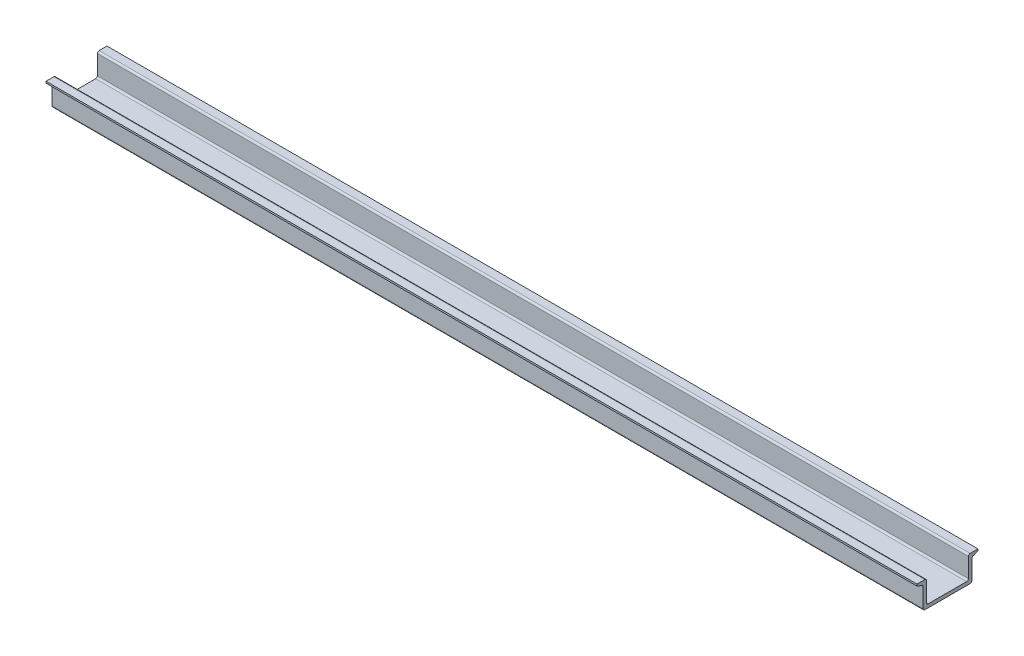
ISO-10303-21;
HEADER;
FILE_DESCRIPTION(('STEP AP214'),'2;1');
FILE_NAME('part.step','',(''),(''),'','','');
FILE_SCHEMA(('AUTOMOTIVE_DESIGN { 1 0 10303 214 1 1 1 1 }'));
ENDSEC;
DATA;
#1=APPLICATION_CONTEXT('core data for automotive mechanical design processes');
#2=APPLICATION_PROTOCOL_DEFINITION('international standard','automotive_design',2000,#1);
#3=PRODUCT_CONTEXT('',#1,'mechanical');
#4=PRODUCT('Part','Part','',(#3));
#5=PRODUCT_RELATED_PRODUCT_CATEGORY('part','',(#4));
#6=PRODUCT_DEFINITION_FORMATION('','',#4);
#7=PRODUCT_DEFINITION_CONTEXT('part definition',#1,'design');
#8=PRODUCT_DEFINITION('design','',#6,#7);
#9=PRODUCT_DEFINITION_SHAPE('','',#8);
#10=(LENGTH_UNIT() NAMED_UNIT(*) SI_UNIT(.MILLI.,.METRE.));
#11=(NAMED_UNIT(*) PLANE_ANGLE_UNIT() SI_UNIT($,.RADIAN.));
#12=(NAMED_UNIT(*) SI_UNIT($,.STERADIAN.) SOLID_ANGLE_UNIT());
#13=UNCERTAINTY_MEASURE_WITH_UNIT(LENGTH_MEASURE(1.E-05),#10,'distance_accuracy_value','');
#14=(GEOMETRIC_REPRESENTATION_CONTEXT(3) GLOBAL_UNCERTAINTY_ASSIGNED_CONTEXT((#13)) GLOBAL_UNIT_ASSIGNED_CONTEXT((#10,
#11,#12)) REPRESENTATION_CONTEXT('',''));
#15=CARTESIAN_POINT('',(0.,0.,0.));
#16=DIRECTION('',(0.,0.,1.));
#17=DIRECTION('',(1.,0.,0.));
#18=AXIS2_PLACEMENT_3D('',#15,#16,#17);
#19=CARTESIAN_POINT('',(500.,-2.,0.));
#20=DIRECTION('',(0.,0.,-1.));
#21=DIRECTION('',(-1.,0.,0.));
#22=AXIS2_PLACEMENT_3D('',#19,#20,#21);
#23=PLANE('',#22);
#24=DIRECTION('',(0.,-1.,0.));
#25=VECTOR('',#24,1.);
#26=CARTESIAN_POINT('',(0.,-2.,0.));
#27=LINE('',#26,#25);
#28=CARTESIAN_POINT('',(0.,0.,0.));
#29=VERTEX_POINT('',#28);
#30=CARTESIAN_POINT('',(0.,-1.0027628361955,0.));
#31=VERTEX_POINT('',#30);
#32=EDGE_CURVE('E208',#29,#31,#27,.T.);
#33=ORIENTED_EDGE('',*,*,#32,.T.);
#34=DIRECTION('',(1.,0.,0.));
#35=VECTOR('',#34,1.);
#36=CARTESIAN_POINT('',(500.,-1.0027628361955,0.));
#37=LINE('',#36,#35);
#38=CARTESIAN_POINT('',(500.,-1.0027628361955,0.));
#39=VERTEX_POINT('',#38);
#40=EDGE_CURVE('E310',#31,#39,#37,.T.);
#41=ORIENTED_EDGE('',*,*,#40,.T.);
#42=DIRECTION('',(0.,-1.,0.));
#43=VECTOR('',#42,1.);
#44=CARTESIAN_POINT('',(500.,-2.,0.));
#45=LINE('',#44,#43);
#46=CARTESIAN_POINT('',(500.,0.,0.));
#47=VERTEX_POINT('',#46);
#48=EDGE_CURVE('E234',#47,#39,#45,.T.);
#49=ORIENTED_EDGE('',*,*,#48,.F.);
#50=DIRECTION('',(-1.,0.,0.));
#51=VECTOR('',#50,1.);
#52=CARTESIAN_POINT('',(500.,0.,0.));
#53=LINE('',#52,#51);
#54=EDGE_CURVE('E189',#47,#29,#53,.T.);
#55=ORIENTED_EDGE('',*,*,#54,.T.);
#56=EDGE_LOOP('',(#33,#41,#49,#55));
#57=FACE_BOUND('',#56,.T.);
#58=ADVANCED_FACE('F33',(#57),#23,.F.);
#59=CARTESIAN_POINT('',(500.,-15.,-3.5));
#60=DIRECTION('',(0.,0.,-1.));
#61=DIRECTION('',(-1.,0.,0.));
#62=AXIS2_PLACEMENT_3D('',#59,#60,#61);
#63=PLANE('',#62);
#64=DIRECTION('',(0.,-1.,0.));
#65=VECTOR('',#64,1.);
#66=CARTESIAN_POINT('',(500.,-15.,-3.5));
#67=LINE('',#66,#65);
#68=CARTESIAN_POINT('',(500.,-3.,-3.5));
#69=VERTEX_POINT('',#68);
#70=CARTESIAN_POINT('',(500.,-14.,-3.5));
#71=VERTEX_POINT('',#70);
#72=EDGE_CURVE('E357',#69,#71,#67,.T.);
#73=ORIENTED_EDGE('',*,*,#72,.F.);
#74=DIRECTION('',(-1.,0.,0.));
#75=VECTOR('',#74,1.);
#76=CARTESIAN_POINT('',(0.,-3.,-3.5));
#77=LINE('',#76,#75);
#78=CARTESIAN_POINT('',(0.,-3.,-3.5));
#79=VERTEX_POINT('',#78);
#80=EDGE_CURVE('E273',#69,#79,#77,.T.);
#81=ORIENTED_EDGE('',*,*,#80,.T.);
#82=DIRECTION('',(0.,-1.,0.));
#83=VECTOR('',#82,1.);
#84=CARTESIAN_POINT('',(0.,-15.,-3.5));
#85=LINE('',#84,#83);
#86=CARTESIAN_POINT('',(0.,-14.,-3.5));
#87=VERTEX_POINT('',#86);
#88=EDGE_CURVE('E211',#79,#87,#85,.T.);
#89=ORIENTED_EDGE('',*,*,#88,.T.);
#90=DIRECTION('',(-1.,0.,0.));
#91=VECTOR('',#90,1.);
#92=CARTESIAN_POINT('',(500.,-14.,-3.5));
#93=LINE('',#92,#91);
#94=EDGE_CURVE('E271',#87,#71,#93,.F.);
#95=ORIENTED_EDGE('',*,*,#94,.T.);
#96=EDGE_LOOP('',(#73,#81,#89,#95));
#97=FACE_BOUND('',#96,.T.);
#98=ADVANCED_FACE('F395',(#97),#63,.F.);
#99=CARTESIAN_POINT('',(500.,-15.,-31.5));
#100=DIRECTION('',(0.,1.,0.));
#101=DIRECTION('',(0.,0.,1.));
#102=AXIS2_PLACEMENT_3D('',#99,#100,#101);
#103=PLANE('',#102);
#104=DIRECTION('',(0.,0.,-1.));
#105=VECTOR('',#104,1.);
#106=CARTESIAN_POINT('',(500.,-15.,-31.5));
#107=LINE('',#106,#105);
#108=CARTESIAN_POINT('',(500.,-15.,-4.50000000000001));
#109=VERTEX_POINT('',#108);
#110=CARTESIAN_POINT('',(500.,-15.,-30.5));
#111=VERTEX_POINT('',#110);
#112=EDGE_CURVE('E360',#109,#111,#107,.T.);
#113=ORIENTED_EDGE('',*,*,#112,.F.);
#114=DIRECTION('',(-1.,0.,0.));
#115=VECTOR('',#114,1.);
#116=CARTESIAN_POINT('',(500.,-15.,-4.5));
#117=LINE('',#116,#115);
#118=CARTESIAN_POINT('',(0.,-15.,-4.50000000000001));
#119=VERTEX_POINT('',#118);
#120=EDGE_CURVE('E278',#109,#119,#117,.T.);
#121=ORIENTED_EDGE('',*,*,#120,.T.);
#122=DIRECTION('',(0.,0.,-1.));
#123=VECTOR('',#122,1.);
#124=CARTESIAN_POINT('',(0.,-15.,-31.5));
#125=LINE('',#124,#123);
#126=CARTESIAN_POINT('',(0.,-15.,-30.5));
#127=VERTEX_POINT('',#126);
#128=EDGE_CURVE('E214',#119,#127,#125,.T.);
#129=ORIENTED_EDGE('',*,*,#128,.T.);
#130=DIRECTION('',(-1.,0.,0.));
#131=VECTOR('',#130,1.);
#132=CARTESIAN_POINT('',(500.,-15.,-30.5));
#133=LINE('',#132,#131);
#134=EDGE_CURVE('E276',#127,#111,#133,.F.);
#135=ORIENTED_EDGE('',*,*,#134,.T.);
#136=EDGE_LOOP('',(#113,#121,#129,#135));
#137=FACE_BOUND('',#136,.T.);
#138=ADVANCED_FACE('F378',(#137),#103,.F.);
#139=CARTESIAN_POINT('',(500.,-2.,-31.5));
#140=DIRECTION('',(0.,0.,1.));
#141=DIRECTION('',(1.,0.,0.));
#142=AXIS2_PLACEMENT_3D('',#139,#140,#141);
#143=PLANE('',#142);
#144=DIRECTION('',(0.,1.,0.));
#145=VECTOR('',#144,1.);
#146=CARTESIAN_POINT('',(500.,-2.,-31.5));
#147=LINE('',#146,#145);
#148=CARTESIAN_POINT('',(500.,-14.,-31.5));
#149=VERTEX_POINT('',#148);
#150=CARTESIAN_POINT('',(500.,-3.,-31.5));
#151=VERTEX_POINT('',#150);
#152=EDGE_CURVE('E178',#149,#151,#147,.T.);
#153=ORIENTED_EDGE('',*,*,#152,.F.);
#154=DIRECTION('',(-1.,0.,0.));
#155=VECTOR('',#154,1.);
#156=CARTESIAN_POINT('',(500.,-14.,-31.5));
#157=LINE('',#156,#155);
#158=CARTESIAN_POINT('',(0.,-14.,-31.5));
#159=VERTEX_POINT('',#158);
#160=EDGE_CURVE('E283',#149,#159,#157,.T.);
#161=ORIENTED_EDGE('',*,*,#160,.T.);
#162=DIRECTION('',(0.,1.,0.));
#163=VECTOR('',#162,1.);
#164=CARTESIAN_POINT('',(0.,-2.,-31.5));
#165=LINE('',#164,#163);
#166=CARTESIAN_POINT('',(0.,-3.,-31.5));
#167=VERTEX_POINT('',#166);
#168=EDGE_CURVE('E217',#159,#167,#165,.T.);
#169=ORIENTED_EDGE('',*,*,#168,.T.);
#170=DIRECTION('',(-1.,0.,0.));
#171=VECTOR('',#170,1.);
#172=CARTESIAN_POINT('',(500.,-3.,-31.5));
#173=LINE('',#172,#171);
#174=EDGE_CURVE('E281',#167,#151,#173,.F.);
#175=ORIENTED_EDGE('',*,*,#174,.T.);
#176=EDGE_LOOP('',(#153,#161,#169,#175));
#177=FACE_BOUND('',#176,.T.);
#178=ADVANCED_FACE('F371',(#177),#143,.F.);
#179=CARTESIAN_POINT('',(500.,0.,-35.));
#180=DIRECTION('',(0.,0.,1.));
#181=DIRECTION('',(1.,0.,0.));
#182=AXIS2_PLACEMENT_3D('',#179,#180,#181);
#183=PLANE('',#182);
#184=DIRECTION('',(0.,1.,0.));
#185=VECTOR('',#184,1.);
#186=CARTESIAN_POINT('',(500.,0.,-35.));
#187=LINE('',#186,#185);
#188=CARTESIAN_POINT('',(500.,-1.0027628361955,-35.));
#189=VERTEX_POINT('',#188);
#190=CARTESIAN_POINT('',(500.,0.,-35.));
#191=VERTEX_POINT('',#190);
#192=EDGE_CURVE('E168',#189,#191,#187,.T.);
#193=ORIENTED_EDGE('',*,*,#192,.F.);
#194=DIRECTION('',(-1.,0.,0.));
#195=VECTOR('',#194,1.);
#196=CARTESIAN_POINT('',(500.,-1.0027628361955,-35.));
#197=LINE('',#196,#195);
#198=CARTESIAN_POINT('',(0.,-1.0027628361955,-35.));
#199=VERTEX_POINT('',#198);
#200=EDGE_CURVE('E41',#189,#199,#197,.T.);
#201=ORIENTED_EDGE('',*,*,#200,.T.);
#202=DIRECTION('',(0.,1.,0.));
#203=VECTOR('',#202,1.);
#204=CARTESIAN_POINT('',(0.,0.,-35.));
#205=LINE('',#204,#203);
#206=CARTESIAN_POINT('',(0.,0.,-35.));
#207=VERTEX_POINT('',#206);
#208=EDGE_CURVE('E184',#199,#207,#205,.T.);
#209=ORIENTED_EDGE('',*,*,#208,.T.);
#210=DIRECTION('',(-1.,0.,0.));
#211=VECTOR('',#210,1.);
#212=CARTESIAN_POINT('',(500.,0.,-35.));
#213=LINE('',#212,#211);
#214=EDGE_CURVE('E181',#191,#207,#213,.T.);
#215=ORIENTED_EDGE('',*,*,#214,.F.);
#216=EDGE_LOOP('',(#193,#201,#209,#215));
#217=FACE_BOUND('',#216,.T.);
#218=ADVANCED_FACE('F182',(#217),#183,.F.);
#219=CARTESIAN_POINT('',(500.,0.,-29.5));
#220=DIRECTION('',(0.,-1.,0.));
#221=DIRECTION('',(0.,0.,-1.));
#222=AXIS2_PLACEMENT_3D('',#219,#220,#221);
#223=PLANE('',#222);
#224=DIRECTION('',(0.,0.,1.));
#225=VECTOR('',#224,1.);
#226=CARTESIAN_POINT('',(0.,0.,-29.5));
#227=LINE('',#226,#225);
#228=CARTESIAN_POINT('',(0.,0.,-30.5));
#229=VERTEX_POINT('',#228);
#230=EDGE_CURVE('E221',#207,#229,#227,.T.);
#231=ORIENTED_EDGE('',*,*,#230,.T.);
#232=DIRECTION('',(-1.,0.,0.));
#233=VECTOR('',#232,1.);
#234=CARTESIAN_POINT('',(500.,0.,-30.5));
#235=LINE('',#234,#233);
#236=CARTESIAN_POINT('',(500.,0.,-30.5));
#237=VERTEX_POINT('',#236);
#238=EDGE_CURVE('E193',#229,#237,#235,.F.);
#239=ORIENTED_EDGE('',*,*,#238,.T.);
#240=DIRECTION('',(0.,0.,1.));
#241=VECTOR('',#240,1.);
#242=CARTESIAN_POINT('',(500.,0.,-29.5));
#243=LINE('',#242,#241);
#244=EDGE_CURVE('E173',#191,#237,#243,.T.);
#245=ORIENTED_EDGE('',*,*,#244,.F.);
#246=ORIENTED_EDGE('',*,*,#214,.T.);
#247=EDGE_LOOP('',(#231,#239,#245,#246));
#248=FACE_BOUND('',#247,.T.);
#249=ADVANCED_FACE('F191',(#248),#223,.F.);
#250=CARTESIAN_POINT('',(500.,-13.,-29.5));
#251=DIRECTION('',(0.,0.,-1.));
#252=DIRECTION('',(-1.,0.,0.));
#253=AXIS2_PLACEMENT_3D('',#250,#251,#252);
#254=PLANE('',#253);
#255=DIRECTION('',(0.,-1.,0.));
#256=VECTOR('',#255,1.);
#257=CARTESIAN_POINT('',(0.,-13.,-29.5));
#258=LINE('',#257,#256);
#259=CARTESIAN_POINT('',(0.,-0.999999999999999,-29.5));
#260=VERTEX_POINT('',#259);
#261=CARTESIAN_POINT('',(0.,-12.,-29.5));
#262=VERTEX_POINT('',#261);
#263=EDGE_CURVE('E223',#260,#262,#258,.T.);
#264=ORIENTED_EDGE('',*,*,#263,.T.);
#265=DIRECTION('',(-1.,0.,0.));
#266=VECTOR('',#265,1.);
#267=CARTESIAN_POINT('',(500.,-12.,-29.5));
#268=LINE('',#267,#266);
#269=CARTESIAN_POINT('',(500.,-12.,-29.5));
#270=VERTEX_POINT('',#269);
#271=EDGE_CURVE('E268',#262,#270,#268,.F.);
#272=ORIENTED_EDGE('',*,*,#271,.T.);
#273=DIRECTION('',(0.,-1.,0.));
#274=VECTOR('',#273,1.);
#275=CARTESIAN_POINT('',(500.,-13.,-29.5));
#276=LINE('',#275,#274);
#277=CARTESIAN_POINT('',(500.,-0.999999999999999,-29.5));
#278=VERTEX_POINT('',#277);
#279=EDGE_CURVE('E194',#278,#270,#276,.T.);
#280=ORIENTED_EDGE('',*,*,#279,.F.);
#281=DIRECTION('',(-1.,0.,0.));
#282=VECTOR('',#281,1.);
#283=CARTESIAN_POINT('',(500.,-0.999999999999999,-29.5));
#284=LINE('',#283,#282);
#285=EDGE_CURVE('E265',#278,#260,#284,.T.);
#286=ORIENTED_EDGE('',*,*,#285,.T.);
#287=EDGE_LOOP('',(#264,#272,#280,#286));
#288=FACE_BOUND('',#287,.T.);
#289=ADVANCED_FACE('F324',(#288),#254,.F.);
#290=CARTESIAN_POINT('',(500.,-13.,-5.5));
#291=DIRECTION('',(0.,-1.,0.));
#292=DIRECTION('',(0.,0.,-1.));
#293=AXIS2_PLACEMENT_3D('',#290,#291,#292);
#294=PLANE('',#293);
#295=DIRECTION('',(0.,0.,1.));
#296=VECTOR('',#295,1.);
#297=CARTESIAN_POINT('',(0.,-13.,-5.5));
#298=LINE('',#297,#296);
#299=CARTESIAN_POINT('',(0.,-13.,-28.5));
#300=VERTEX_POINT('',#299);
#301=CARTESIAN_POINT('',(0.,-13.,-6.5));
#302=VERTEX_POINT('',#301);
#303=EDGE_CURVE('E226',#300,#302,#298,.T.);
#304=ORIENTED_EDGE('',*,*,#303,.T.);
#305=DIRECTION('',(-1.,0.,0.));
#306=VECTOR('',#305,1.);
#307=CARTESIAN_POINT('',(500.,-13.,-6.5));
#308=LINE('',#307,#306);
#309=CARTESIAN_POINT('',(500.,-13.,-6.5));
#310=VERTEX_POINT('',#309);
#311=EDGE_CURVE('E244',#302,#310,#308,.F.);
#312=ORIENTED_EDGE('',*,*,#311,.T.);
#313=DIRECTION('',(0.,0.,1.));
#314=VECTOR('',#313,1.);
#315=CARTESIAN_POINT('',(500.,-13.,-5.5));
#316=LINE('',#315,#314);
#317=CARTESIAN_POINT('',(500.,-13.,-28.5));
#318=VERTEX_POINT('',#317);
#319=EDGE_CURVE('E197',#318,#310,#316,.T.);
#320=ORIENTED_EDGE('',*,*,#319,.F.);
#321=DIRECTION('',(-1.,0.,0.));
#322=VECTOR('',#321,1.);
#323=CARTESIAN_POINT('',(0.,-13.,-28.5));
#324=LINE('',#323,#322);
#325=EDGE_CURVE('E241',#318,#300,#324,.T.);
#326=ORIENTED_EDGE('',*,*,#325,.T.);
#327=EDGE_LOOP('',(#304,#312,#320,#326));
#328=FACE_BOUND('',#327,.T.);
#329=ADVANCED_FACE('F332',(#328),#294,.F.);
#330=CARTESIAN_POINT('',(500.,0.,-5.5));
#331=DIRECTION('',(0.,0.,1.));
#332=DIRECTION('',(1.,0.,0.));
#333=AXIS2_PLACEMENT_3D('',#330,#331,#332);
#334=PLANE('',#333);
#335=DIRECTION('',(0.,1.,0.));
#336=VECTOR('',#335,1.);
#337=CARTESIAN_POINT('',(500.,0.,-5.5));
#338=LINE('',#337,#336);
#339=CARTESIAN_POINT('',(500.,-12.,-5.5));
#340=VERTEX_POINT('',#339);
#341=CARTESIAN_POINT('',(500.,-1.,-5.5));
#342=VERTEX_POINT('',#341);
#343=EDGE_CURVE('E203',#340,#342,#338,.T.);
#344=ORIENTED_EDGE('',*,*,#343,.F.);
#345=DIRECTION('',(-1.,0.,0.));
#346=VECTOR('',#345,1.);
#347=CARTESIAN_POINT('',(0.,-12.,-5.5));
#348=LINE('',#347,#346);
#349=CARTESIAN_POINT('',(0.,-12.,-5.5));
#350=VERTEX_POINT('',#349);
#351=EDGE_CURVE('E238',#340,#350,#348,.T.);
#352=ORIENTED_EDGE('',*,*,#351,.T.);
#353=DIRECTION('',(0.,1.,0.));
#354=VECTOR('',#353,1.);
#355=CARTESIAN_POINT('',(0.,0.,-5.5));
#356=LINE('',#355,#354);
#357=CARTESIAN_POINT('',(0.,-1.,-5.5));
#358=VERTEX_POINT('',#357);
#359=EDGE_CURVE('E229',#350,#358,#356,.T.);
#360=ORIENTED_EDGE('',*,*,#359,.T.);
#361=DIRECTION('',(-1.,0.,0.));
#362=VECTOR('',#361,1.);
#363=CARTESIAN_POINT('',(500.,-1.,-5.5));
#364=LINE('',#363,#362);
#365=EDGE_CURVE('E188',#358,#342,#364,.F.);
#366=ORIENTED_EDGE('',*,*,#365,.T.);
#367=EDGE_LOOP('',(#344,#352,#360,#366));
#368=FACE_BOUND('',#367,.T.);
#369=ADVANCED_FACE('F341',(#368),#334,.F.);
#370=CARTESIAN_POINT('',(500.,0.,0.));
#371=DIRECTION('',(0.,-1.,0.));
#372=DIRECTION('',(0.,0.,-1.));
#373=AXIS2_PLACEMENT_3D('',#370,#371,#372);
#374=PLANE('',#373);
#375=DIRECTION('',(0.,0.,1.));
#376=VECTOR('',#375,1.);
#377=CARTESIAN_POINT('',(500.,0.,0.));
#378=LINE('',#377,#376);
#379=CARTESIAN_POINT('',(500.,0.,-4.5));
#380=VERTEX_POINT('',#379);
#381=EDGE_CURVE('E206',#380,#47,#378,.T.);
#382=ORIENTED_EDGE('',*,*,#381,.F.);
#383=DIRECTION('',(-1.,0.,0.));
#384=VECTOR('',#383,1.);
#385=CARTESIAN_POINT('',(500.,0.,-4.5));
#386=LINE('',#385,#384);
#387=CARTESIAN_POINT('',(0.,0.,-4.5));
#388=VERTEX_POINT('',#387);
#389=EDGE_CURVE('E246',#380,#388,#386,.T.);
#390=ORIENTED_EDGE('',*,*,#389,.T.);
#391=DIRECTION('',(0.,0.,1.));
#392=VECTOR('',#391,1.);
#393=CARTESIAN_POINT('',(0.,0.,0.));
#394=LINE('',#393,#392);
#395=EDGE_CURVE('E232',#388,#29,#394,.T.);
#396=ORIENTED_EDGE('',*,*,#395,.T.);
#397=ORIENTED_EDGE('',*,*,#54,.F.);
#398=EDGE_LOOP('',(#382,#390,#396,#397));
#399=FACE_BOUND('',#398,.T.);
#400=ADVANCED_FACE('F350',(#399),#374,.F.);
#401=CARTESIAN_POINT('',(500.,0.,0.));
#402=DIRECTION('',(-1.,0.,0.));
#403=DIRECTION('',(0.,0.,1.));
#404=AXIS2_PLACEMENT_3D('',#401,#402,#403);
#405=PLANE('',#404);
#406=ORIENTED_EDGE('',*,*,#48,.T.);
#407=DIRECTION('',(0.,-0.364335059261177,-0.931267933837064));
#408=VECTOR('',#407,1.);
#409=CARTESIAN_POINT('',(500.,-2.00138141809776,-2.55254453234694));
#410=LINE('',#409,#408);
#411=CARTESIAN_POINT('',(500.,-2.00138141809776,-2.55254453234694));
#412=VERTEX_POINT('',#411);
#413=EDGE_CURVE('E313',#39,#412,#410,.T.);
#414=ORIENTED_EDGE('',*,*,#413,.T.);
#415=CARTESIAN_POINT('',(500.,-3.,-2.5));
#416=DIRECTION('',(-1.,0.,0.));
#417=DIRECTION('',(0.,0.,1.));
#418=AXIS2_PLACEMENT_3D('',#415,#416,#417);
#419=CIRCLE('',#418,1.);
#420=EDGE_CURVE('E297',#412,#69,#419,.T.);
#421=ORIENTED_EDGE('',*,*,#420,.T.);
#422=ORIENTED_EDGE('',*,*,#72,.T.);
#423=CARTESIAN_POINT('',(500.,-14.,-4.5));
#424=DIRECTION('',(-1.,0.,0.));
#425=DIRECTION('',(0.,0.,1.));
#426=AXIS2_PLACEMENT_3D('',#423,#424,#425);
#427=CIRCLE('',#426,1.);
#428=EDGE_CURVE('E259',#71,#109,#427,.F.);
#429=ORIENTED_EDGE('',*,*,#428,.T.);
#430=ORIENTED_EDGE('',*,*,#112,.T.);
#431=CARTESIAN_POINT('',(500.,-14.,-30.5));
#432=DIRECTION('',(-1.,0.,0.));
#433=DIRECTION('',(0.,0.,1.));
#434=AXIS2_PLACEMENT_3D('',#431,#432,#433);
#435=CIRCLE('',#434,1.);
#436=EDGE_CURVE('E257',#111,#149,#435,.F.);
#437=ORIENTED_EDGE('',*,*,#436,.T.);
#438=ORIENTED_EDGE('',*,*,#152,.T.);
#439=CARTESIAN_POINT('',(500.,-3.,-32.5));
#440=DIRECTION('',(-1.,0.,0.));
#441=DIRECTION('',(0.,0.,1.));
#442=AXIS2_PLACEMENT_3D('',#439,#440,#441);
#443=CIRCLE('',#442,1.);
#444=CARTESIAN_POINT('',(500.,-2.00138141809776,-32.4474554676531));
#445=VERTEX_POINT('',#444);
#446=EDGE_CURVE('E301',#151,#445,#443,.T.);
#447=ORIENTED_EDGE('',*,*,#446,.T.);
#448=DIRECTION('',(0.,0.364335059261178,-0.931267933837064));
#449=VECTOR('',#448,1.);
#450=CARTESIAN_POINT('',(500.,-1.0027628361955,-35.));
#451=LINE('',#450,#449);
#452=EDGE_CURVE('E48',#445,#189,#451,.T.);
#453=ORIENTED_EDGE('',*,*,#452,.T.);
#454=ORIENTED_EDGE('',*,*,#192,.T.);
#455=ORIENTED_EDGE('',*,*,#244,.T.);
#456=CARTESIAN_POINT('',(500.,-0.999999999999999,-30.5));
#457=DIRECTION('',(-1.,0.,0.));
#458=DIRECTION('',(0.,0.,1.));
#459=AXIS2_PLACEMENT_3D('',#456,#457,#458);
#460=CIRCLE('',#459,1.);
#461=EDGE_CURVE('E261',#237,#278,#460,.F.);
#462=ORIENTED_EDGE('',*,*,#461,.T.);
#463=ORIENTED_EDGE('',*,*,#279,.T.);
#464=CARTESIAN_POINT('',(500.,-12.,-28.5));
#465=DIRECTION('',(-1.,0.,0.));
#466=DIRECTION('',(0.,0.,1.));
#467=AXIS2_PLACEMENT_3D('',#464,#465,#466);
#468=CIRCLE('',#467,1.);
#469=EDGE_CURVE('E292',#270,#318,#468,.T.);
#470=ORIENTED_EDGE('',*,*,#469,.T.);
#471=ORIENTED_EDGE('',*,*,#319,.T.);
#472=CARTESIAN_POINT('',(500.,-12.,-6.5));
#473=DIRECTION('',(-1.,0.,0.));
#474=DIRECTION('',(0.,0.,1.));
#475=AXIS2_PLACEMENT_3D('',#472,#473,#474);
#476=CIRCLE('',#475,1.);
#477=EDGE_CURVE('E288',#310,#340,#476,.T.);
#478=ORIENTED_EDGE('',*,*,#477,.T.);
#479=ORIENTED_EDGE('',*,*,#343,.T.);
#480=CARTESIAN_POINT('',(500.,-1.,-4.5));
#481=DIRECTION('',(-1.,0.,0.));
#482=DIRECTION('',(0.,0.,1.));
#483=AXIS2_PLACEMENT_3D('',#480,#481,#482);
#484=CIRCLE('',#483,1.);
#485=EDGE_CURVE('E263',#342,#380,#484,.F.);
#486=ORIENTED_EDGE('',*,*,#485,.T.);
#487=ORIENTED_EDGE('',*,*,#381,.T.);
#488=EDGE_LOOP('',(#406,#414,#421,#422,#429,#430,#437,#438,#447,#453,#454,#455,#462,#463,#470,
#471,#478,#479,#486,#487));
#489=FACE_BOUND('',#488,.T.);
#490=ADVANCED_FACE('F171',(#489),#405,.F.);
#491=CARTESIAN_POINT('',(0.,0.,0.));
#492=DIRECTION('',(-1.,0.,0.));
#493=DIRECTION('',(0.,0.,1.));
#494=AXIS2_PLACEMENT_3D('',#491,#492,#493);
#495=PLANE('',#494);
#496=CARTESIAN_POINT('',(0.,-3.,-2.5));
#497=DIRECTION('',(-1.,0.,0.));
#498=DIRECTION('',(0.,0.,1.));
#499=AXIS2_PLACEMENT_3D('',#496,#497,#498);
#500=CIRCLE('',#499,1.);
#501=CARTESIAN_POINT('',(0.,-2.00138141809776,-2.55254453234694));
#502=VERTEX_POINT('',#501);
#503=EDGE_CURVE('E294',#79,#502,#500,.F.);
#504=ORIENTED_EDGE('',*,*,#503,.T.);
#505=DIRECTION('',(0.,0.364335059261177,0.931267933837064));
#506=VECTOR('',#505,1.);
#507=CARTESIAN_POINT('',(0.,-0.86965606181424,0.340230970385124));
#508=LINE('',#507,#506);
#509=EDGE_CURVE('E308',#502,#31,#508,.T.);
#510=ORIENTED_EDGE('',*,*,#509,.T.);
#511=ORIENTED_EDGE('',*,*,#32,.F.);
#512=ORIENTED_EDGE('',*,*,#395,.F.);
#513=CARTESIAN_POINT('',(0.,-1.,-4.5));
#514=DIRECTION('',(-1.,0.,0.));
#515=DIRECTION('',(0.,0.,1.));
#516=AXIS2_PLACEMENT_3D('',#513,#514,#515);
#517=CIRCLE('',#516,1.);
#518=EDGE_CURVE('E255',#388,#358,#517,.T.);
#519=ORIENTED_EDGE('',*,*,#518,.T.);
#520=ORIENTED_EDGE('',*,*,#359,.F.);
#521=CARTESIAN_POINT('',(0.,-12.,-6.5));
#522=DIRECTION('',(-1.,0.,0.));
#523=DIRECTION('',(0.,0.,1.));
#524=AXIS2_PLACEMENT_3D('',#521,#522,#523);
#525=CIRCLE('',#524,1.);
#526=EDGE_CURVE('E286',#350,#302,#525,.F.);
#527=ORIENTED_EDGE('',*,*,#526,.T.);
#528=ORIENTED_EDGE('',*,*,#303,.F.);
#529=CARTESIAN_POINT('',(0.,-12.,-28.5));
#530=DIRECTION('',(-1.,0.,0.));
#531=DIRECTION('',(0.,0.,1.));
#532=AXIS2_PLACEMENT_3D('',#529,#530,#531);
#533=CIRCLE('',#532,1.);
#534=EDGE_CURVE('E290',#300,#262,#533,.F.);
#535=ORIENTED_EDGE('',*,*,#534,.T.);
#536=ORIENTED_EDGE('',*,*,#263,.F.);
#537=CARTESIAN_POINT('',(0.,-0.999999999999999,-30.5));
#538=DIRECTION('',(-1.,0.,0.));
#539=DIRECTION('',(0.,0.,1.));
#540=AXIS2_PLACEMENT_3D('',#537,#538,#539);
#541=CIRCLE('',#540,1.);
#542=EDGE_CURVE('E253',#260,#229,#541,.T.);
#543=ORIENTED_EDGE('',*,*,#542,.T.);
#544=ORIENTED_EDGE('',*,*,#230,.F.);
#545=ORIENTED_EDGE('',*,*,#208,.F.);
#546=DIRECTION('',(0.,-0.364335059261178,0.931267933837064));
#547=VECTOR('',#546,1.);
#548=CARTESIAN_POINT('',(0.,-12.7449305870039,-4.98613220962474));
#549=LINE('',#548,#547);
#550=CARTESIAN_POINT('',(0.,-2.00138141809776,-32.4474554676531));
#551=VERTEX_POINT('',#550);
#552=EDGE_CURVE('E306',#199,#551,#549,.T.);
#553=ORIENTED_EDGE('',*,*,#552,.T.);
#554=CARTESIAN_POINT('',(0.,-3.,-32.5));
#555=DIRECTION('',(-1.,0.,0.));
#556=DIRECTION('',(0.,0.,1.));
#557=AXIS2_PLACEMENT_3D('',#554,#555,#556);
#558=CIRCLE('',#557,1.);
#559=EDGE_CURVE('E299',#551,#167,#558,.F.);
#560=ORIENTED_EDGE('',*,*,#559,.T.);
#561=ORIENTED_EDGE('',*,*,#168,.F.);
#562=CARTESIAN_POINT('',(0.,-14.,-30.5));
#563=DIRECTION('',(-1.,0.,0.));
#564=DIRECTION('',(0.,0.,1.));
#565=AXIS2_PLACEMENT_3D('',#562,#563,#564);
#566=CIRCLE('',#565,1.);
#567=EDGE_CURVE('E249',#159,#127,#566,.T.);
#568=ORIENTED_EDGE('',*,*,#567,.T.);
#569=ORIENTED_EDGE('',*,*,#128,.F.);
#570=CARTESIAN_POINT('',(0.,-14.,-4.5));
#571=DIRECTION('',(-1.,0.,0.));
#572=DIRECTION('',(0.,0.,1.));
#573=AXIS2_PLACEMENT_3D('',#570,#571,#572);
#574=CIRCLE('',#573,1.);
#575=EDGE_CURVE('E251',#119,#87,#574,.T.);
#576=ORIENTED_EDGE('',*,*,#575,.T.);
#577=ORIENTED_EDGE('',*,*,#88,.F.);
#578=EDGE_LOOP('',(#504,#510,#511,#512,#519,#520,#527,#528,#535,#536,#543,#544,#545,#553,#560,
#561,#568,#569,#576,#577));
#579=FACE_BOUND('',#578,.T.);
#580=ADVANCED_FACE('F316',(#579),#495,.T.);
#581=CARTESIAN_POINT('',(500.,-12.,-6.5));
#582=DIRECTION('',(1.,0.,0.));
#583=DIRECTION('',(0.,0.,-1.));
#584=AXIS2_PLACEMENT_3D('',#581,#582,#583);
#585=CYLINDRICAL_SURFACE('',#584,1.);
#586=ORIENTED_EDGE('',*,*,#477,.F.);
#587=ORIENTED_EDGE('',*,*,#311,.F.);
#588=ORIENTED_EDGE('',*,*,#526,.F.);
#589=ORIENTED_EDGE('',*,*,#351,.F.);
#590=EDGE_LOOP('',(#586,#587,#588,#589));
#591=FACE_BOUND('',#590,.T.);
#592=ADVANCED_FACE('F336',(#591),#585,.F.);
#593=CARTESIAN_POINT('',(500.,-1.,-4.5));
#594=DIRECTION('',(-1.,0.,0.));
#595=DIRECTION('',(0.,0.,1.));
#596=AXIS2_PLACEMENT_3D('',#593,#594,#595);
#597=CYLINDRICAL_SURFACE('',#596,1.);
#598=ORIENTED_EDGE('',*,*,#485,.F.);
#599=ORIENTED_EDGE('',*,*,#365,.F.);
#600=ORIENTED_EDGE('',*,*,#518,.F.);
#601=ORIENTED_EDGE('',*,*,#389,.F.);
#602=EDGE_LOOP('',(#598,#599,#600,#601));
#603=FACE_BOUND('',#602,.T.);
#604=ADVANCED_FACE('F345',(#603),#597,.T.);
#605=CARTESIAN_POINT('',(500.,-12.,-28.5));
#606=DIRECTION('',(1.,0.,0.));
#607=DIRECTION('',(0.,0.,-1.));
#608=AXIS2_PLACEMENT_3D('',#605,#606,#607);
#609=CYLINDRICAL_SURFACE('',#608,1.);
#610=ORIENTED_EDGE('',*,*,#469,.F.);
#611=ORIENTED_EDGE('',*,*,#271,.F.);
#612=ORIENTED_EDGE('',*,*,#534,.F.);
#613=ORIENTED_EDGE('',*,*,#325,.F.);
#614=EDGE_LOOP('',(#610,#611,#612,#613));
#615=FACE_BOUND('',#614,.T.);
#616=ADVANCED_FACE('F327',(#615),#609,.F.);
#617=CARTESIAN_POINT('',(500.,-0.999999999999999,-30.5));
#618=DIRECTION('',(-1.,0.,0.));
#619=DIRECTION('',(0.,0.,1.));
#620=AXIS2_PLACEMENT_3D('',#617,#618,#619);
#621=CYLINDRICAL_SURFACE('',#620,1.);
#622=ORIENTED_EDGE('',*,*,#461,.F.);
#623=ORIENTED_EDGE('',*,*,#238,.F.);
#624=ORIENTED_EDGE('',*,*,#542,.F.);
#625=ORIENTED_EDGE('',*,*,#285,.F.);
#626=EDGE_LOOP('',(#622,#623,#624,#625));
#627=FACE_BOUND('',#626,.T.);
#628=ADVANCED_FACE('F319',(#627),#621,.T.);
#629=CARTESIAN_POINT('',(500.,-3.,-2.5));
#630=DIRECTION('',(1.,0.,0.));
#631=DIRECTION('',(0.,0.,-1.));
#632=AXIS2_PLACEMENT_3D('',#629,#630,#631);
#633=CYLINDRICAL_SURFACE('',#632,1.);
#634=ORIENTED_EDGE('',*,*,#420,.F.);
#635=DIRECTION('',(1.,0.,0.));
#636=VECTOR('',#635,1.);
#637=CARTESIAN_POINT('',(500.,-2.00138141809776,-2.55254453234694));
#638=LINE('',#637,#636);
#639=EDGE_CURVE('E303',#412,#502,#638,.F.);
#640=ORIENTED_EDGE('',*,*,#639,.T.);
#641=ORIENTED_EDGE('',*,*,#503,.F.);
#642=ORIENTED_EDGE('',*,*,#80,.F.);
#643=EDGE_LOOP('',(#634,#640,#641,#642));
#644=FACE_BOUND('',#643,.T.);
#645=ADVANCED_FACE('F391',(#644),#633,.F.);
#646=CARTESIAN_POINT('',(500.,-14.,-4.5));
#647=DIRECTION('',(-1.,0.,0.));
#648=DIRECTION('',(0.,0.,1.));
#649=AXIS2_PLACEMENT_3D('',#646,#647,#648);
#650=CYLINDRICAL_SURFACE('',#649,1.);
#651=ORIENTED_EDGE('',*,*,#428,.F.);
#652=ORIENTED_EDGE('',*,*,#94,.F.);
#653=ORIENTED_EDGE('',*,*,#575,.F.);
#654=ORIENTED_EDGE('',*,*,#120,.F.);
#655=EDGE_LOOP('',(#651,#652,#653,#654));
#656=FACE_BOUND('',#655,.T.);
#657=ADVANCED_FACE('F382',(#656),#650,.T.);
#658=CARTESIAN_POINT('',(500.,-14.,-30.5));
#659=DIRECTION('',(-1.,0.,0.));
#660=DIRECTION('',(0.,0.,1.));
#661=AXIS2_PLACEMENT_3D('',#658,#659,#660);
#662=CYLINDRICAL_SURFACE('',#661,1.);
#663=ORIENTED_EDGE('',*,*,#436,.F.);
#664=ORIENTED_EDGE('',*,*,#134,.F.);
#665=ORIENTED_EDGE('',*,*,#567,.F.);
#666=ORIENTED_EDGE('',*,*,#160,.F.);
#667=EDGE_LOOP('',(#663,#664,#665,#666));
#668=FACE_BOUND('',#667,.T.);
#669=ADVANCED_FACE('F380',(#668),#662,.T.);
#670=CARTESIAN_POINT('',(500.,-3.,-32.5));
#671=DIRECTION('',(1.,0.,0.));
#672=DIRECTION('',(0.,0.,-1.));
#673=AXIS2_PLACEMENT_3D('',#670,#671,#672);
#674=CYLINDRICAL_SURFACE('',#673,1.);
#675=ORIENTED_EDGE('',*,*,#559,.F.);
#676=DIRECTION('',(1.,0.,0.));
#677=VECTOR('',#676,1.);
#678=CARTESIAN_POINT('',(500.,-2.00138141809776,-32.4474554676531));
#679=LINE('',#678,#677);
#680=EDGE_CURVE('E11',#551,#445,#679,.T.);
#681=ORIENTED_EDGE('',*,*,#680,.T.);
#682=ORIENTED_EDGE('',*,*,#446,.F.);
#683=ORIENTED_EDGE('',*,*,#174,.F.);
#684=EDGE_LOOP('',(#675,#681,#682,#683));
#685=FACE_BOUND('',#684,.T.);
#686=ADVANCED_FACE('F370',(#685),#674,.F.);
#687=CARTESIAN_POINT('',(500.,-2.00138141809776,-2.55254453234694));
#688=DIRECTION('',(0.,-0.931267933837064,0.364335059261177));
#689=DIRECTION('',(1.,0.,0.));
#690=AXIS2_PLACEMENT_3D('',#687,#688,#689);
#691=PLANE('',#690);
#692=ORIENTED_EDGE('',*,*,#413,.F.);
#693=ORIENTED_EDGE('',*,*,#40,.F.);
#694=ORIENTED_EDGE('',*,*,#509,.F.);
#695=ORIENTED_EDGE('',*,*,#639,.F.);
#696=EDGE_LOOP('',(#692,#693,#694,#695));
#697=FACE_BOUND('',#696,.T.);
#698=ADVANCED_FACE('F389',(#697),#691,.T.);
#699=CARTESIAN_POINT('',(500.,-1.0027628361955,-35.));
#700=DIRECTION('',(0.,-0.931267933837064,-0.364335059261178));
#701=DIRECTION('',(1.,0.,0.));
#702=AXIS2_PLACEMENT_3D('',#699,#700,#701);
#703=PLANE('',#702);
#704=ORIENTED_EDGE('',*,*,#452,.F.);
#705=ORIENTED_EDGE('',*,*,#680,.F.);
#706=ORIENTED_EDGE('',*,*,#552,.F.);
#707=ORIENTED_EDGE('',*,*,#200,.F.);
#708=EDGE_LOOP('',(#704,#705,#706,#707));
#709=FACE_BOUND('',#708,.T.);
#710=ADVANCED_FACE('F35',(#709),#703,.T.);
#711=CLOSED_SHELL('',(#58,#98,#138,#178,#218,#249,#289,#329,#369,#400,#490,#580,#592,#604,#616,
#628,#645,#657,#669,#686,#698,#710));
#712=MANIFOLD_SOLID_BREP('B2',#711);
#713=ADVANCED_BREP_SHAPE_REPRESENTATION('',(#18,#712),#14);
#714=SHAPE_DEFINITION_REPRESENTATION(#9,#713);
ENDSEC;
END-ISO-10303-21;
